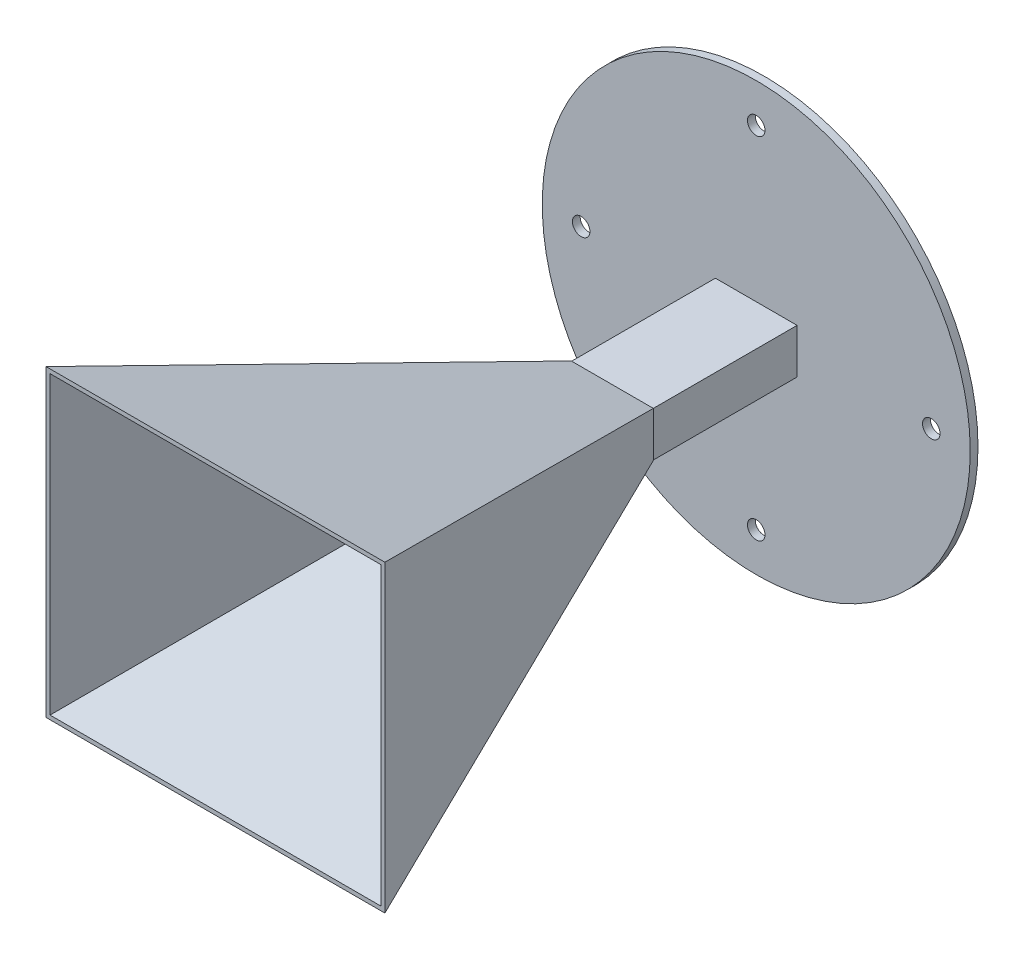
ISO-10303-21;
HEADER;
FILE_DESCRIPTION(('STEP AP214'),'2;1');
FILE_NAME('part.step','',(''),(''),'','','');
FILE_SCHEMA(('AUTOMOTIVE_DESIGN { 1 0 10303 214 1 1 1 1 }'));
ENDSEC;
DATA;
#1=APPLICATION_CONTEXT('core data for automotive mechanical design processes');
#2=APPLICATION_PROTOCOL_DEFINITION('international standard','automotive_design',2000,#1);
#3=PRODUCT_CONTEXT('',#1,'mechanical');
#4=PRODUCT('Part','Part','',(#3));
#5=PRODUCT_RELATED_PRODUCT_CATEGORY('part','',(#4));
#6=PRODUCT_DEFINITION_FORMATION('','',#4);
#7=PRODUCT_DEFINITION_CONTEXT('part definition',#1,'design');
#8=PRODUCT_DEFINITION('design','',#6,#7);
#9=PRODUCT_DEFINITION_SHAPE('','',#8);
#10=(LENGTH_UNIT() NAMED_UNIT(*) SI_UNIT(.MILLI.,.METRE.));
#11=(NAMED_UNIT(*) PLANE_ANGLE_UNIT() SI_UNIT($,.RADIAN.));
#12=(NAMED_UNIT(*) SI_UNIT($,.STERADIAN.) SOLID_ANGLE_UNIT());
#13=UNCERTAINTY_MEASURE_WITH_UNIT(LENGTH_MEASURE(1.E-05),#10,'distance_accuracy_value','');
#14=(GEOMETRIC_REPRESENTATION_CONTEXT(3) GLOBAL_UNCERTAINTY_ASSIGNED_CONTEXT((#13)) GLOBAL_UNIT_ASSIGNED_CONTEXT((#10,
#11,#12)) REPRESENTATION_CONTEXT('',''));
#15=CARTESIAN_POINT('',(0.,0.,0.));
#16=DIRECTION('',(0.,0.,1.));
#17=DIRECTION('',(1.,0.,0.));
#18=AXIS2_PLACEMENT_3D('',#15,#16,#17);
#19=CARTESIAN_POINT('',(0.,0.,2.));
#20=DIRECTION('',(0.,0.,1.));
#21=DIRECTION('',(1.,0.,0.));
#22=AXIS2_PLACEMENT_3D('',#19,#20,#21);
#23=PLANE('',#22);
#24=CARTESIAN_POINT('',(-45.,4.71349980743823E-13,2.));
#25=DIRECTION('',(0.,0.,1.));
#26=DIRECTION('',(1.,0.,0.));
#27=AXIS2_PLACEMENT_3D('',#24,#25,#26);
#28=CIRCLE('',#27,2.24999999999999);
#29=CARTESIAN_POINT('',(-42.75,4.71349980743823E-13,2.));
#30=VERTEX_POINT('',#29);
#31=EDGE_CURVE('E528',#30,#30,#28,.T.);
#32=ORIENTED_EDGE('',*,*,#31,.F.);
#33=EDGE_LOOP('',(#32));
#34=FACE_BOUND('',#33,.T.);
#35=CARTESIAN_POINT('',(0.,-45.,2.));
#36=DIRECTION('',(0.,0.,1.));
#37=DIRECTION('',(1.,0.,0.));
#38=AXIS2_PLACEMENT_3D('',#35,#36,#37);
#39=CIRCLE('',#38,2.24999999999999);
#40=CARTESIAN_POINT('',(2.24999999999999,-45.,2.));
#41=VERTEX_POINT('',#40);
#42=EDGE_CURVE('E529',#41,#41,#39,.T.);
#43=ORIENTED_EDGE('',*,*,#42,.F.);
#44=EDGE_LOOP('',(#43));
#45=FACE_BOUND('',#44,.T.);
#46=CARTESIAN_POINT('',(45.,-1.57116660247941E-13,2.));
#47=DIRECTION('',(0.,0.,1.));
#48=DIRECTION('',(1.,0.,0.));
#49=AXIS2_PLACEMENT_3D('',#46,#47,#48);
#50=CIRCLE('',#49,2.24999999999999);
#51=CARTESIAN_POINT('',(47.25,-1.57116660247941E-13,2.));
#52=VERTEX_POINT('',#51);
#53=EDGE_CURVE('E535',#52,#52,#50,.T.);
#54=ORIENTED_EDGE('',*,*,#53,.F.);
#55=EDGE_LOOP('',(#54));
#56=FACE_BOUND('',#55,.T.);
#57=CARTESIAN_POINT('',(0.,45.,2.));
#58=DIRECTION('',(0.,0.,1.));
#59=DIRECTION('',(1.,0.,0.));
#60=AXIS2_PLACEMENT_3D('',#57,#58,#59);
#61=CIRCLE('',#60,2.24999999999999);
#62=CARTESIAN_POINT('',(2.24999999999999,45.,2.));
#63=VERTEX_POINT('',#62);
#64=EDGE_CURVE('E205',#63,#63,#61,.T.);
#65=ORIENTED_EDGE('',*,*,#64,.F.);
#66=EDGE_LOOP('',(#65));
#67=FACE_BOUND('',#66,.T.);
#68=CARTESIAN_POINT('',(0.,0.,2.));
#69=DIRECTION('',(0.,0.,1.));
#70=DIRECTION('',(1.,0.,0.));
#71=AXIS2_PLACEMENT_3D('',#68,#69,#70);
#72=CIRCLE('',#71,55.);
#73=CARTESIAN_POINT('',(55.,0.,2.));
#74=VERTEX_POINT('',#73);
#75=EDGE_CURVE('E244',#74,#74,#72,.T.);
#76=ORIENTED_EDGE('',*,*,#75,.T.);
#77=EDGE_LOOP('',(#76));
#78=FACE_BOUND('',#77,.T.);
#79=DIRECTION('',(-1.,0.,0.));
#80=VECTOR('',#79,1.);
#81=CARTESIAN_POINT('',(0.,5.75,2.));
#82=LINE('',#81,#80);
#83=CARTESIAN_POINT('',(10.5,5.75,2.));
#84=VERTEX_POINT('',#83);
#85=CARTESIAN_POINT('',(-10.5,5.75,2.));
#86=VERTEX_POINT('',#85);
#87=EDGE_CURVE('E229',#84,#86,#82,.T.);
#88=ORIENTED_EDGE('',*,*,#87,.F.);
#89=DIRECTION('',(0.,1.,0.));
#90=VECTOR('',#89,1.);
#91=CARTESIAN_POINT('',(10.5,0.,2.));
#92=LINE('',#91,#90);
#93=CARTESIAN_POINT('',(10.5,-5.75,2.));
#94=VERTEX_POINT('',#93);
#95=EDGE_CURVE('E226',#94,#84,#92,.T.);
#96=ORIENTED_EDGE('',*,*,#95,.F.);
#97=DIRECTION('',(1.,0.,0.));
#98=VECTOR('',#97,1.);
#99=CARTESIAN_POINT('',(0.,-5.75,2.));
#100=LINE('',#99,#98);
#101=CARTESIAN_POINT('',(-10.5,-5.75,2.));
#102=VERTEX_POINT('',#101);
#103=EDGE_CURVE('E216',#102,#94,#100,.T.);
#104=ORIENTED_EDGE('',*,*,#103,.F.);
#105=DIRECTION('',(0.,-1.,0.));
#106=VECTOR('',#105,1.);
#107=CARTESIAN_POINT('',(-10.5,0.,2.));
#108=LINE('',#107,#106);
#109=EDGE_CURVE('E232',#86,#102,#108,.T.);
#110=ORIENTED_EDGE('',*,*,#109,.F.);
#111=EDGE_LOOP('',(#88,#96,#104,#110));
#112=FACE_BOUND('',#111,.T.);
#113=ADVANCED_FACE('F68',(#34,#45,#56,#67,#78,#112),#23,.T.);
#114=CARTESIAN_POINT('',(0.,0.,2.));
#115=DIRECTION('',(0.,0.,-1.));
#116=DIRECTION('',(-1.,0.,0.));
#117=AXIS2_PLACEMENT_3D('',#114,#115,#116);
#118=CYLINDRICAL_SURFACE('',#117,55.);
#119=ORIENTED_EDGE('',*,*,#75,.F.);
#120=EDGE_LOOP('',(#119));
#121=FACE_BOUND('',#120,.T.);
#122=CARTESIAN_POINT('',(0.,0.,0.));
#123=DIRECTION('',(0.,0.,1.));
#124=DIRECTION('',(1.,0.,0.));
#125=AXIS2_PLACEMENT_3D('',#122,#123,#124);
#126=CIRCLE('',#125,55.);
#127=CARTESIAN_POINT('',(55.,0.,0.));
#128=VERTEX_POINT('',#127);
#129=EDGE_CURVE('E243',#128,#128,#126,.T.);
#130=ORIENTED_EDGE('',*,*,#129,.T.);
#131=EDGE_LOOP('',(#130));
#132=FACE_BOUND('',#131,.T.);
#133=ADVANCED_FACE('F70',(#121,#132),#118,.T.);
#134=CARTESIAN_POINT('',(0.,0.,0.));
#135=DIRECTION('',(0.,0.,1.));
#136=DIRECTION('',(1.,0.,0.));
#137=AXIS2_PLACEMENT_3D('',#134,#135,#136);
#138=PLANE('',#137);
#139=CARTESIAN_POINT('',(-45.,4.71349980743823E-13,0.));
#140=DIRECTION('',(0.,0.,1.));
#141=DIRECTION('',(1.,0.,0.));
#142=AXIS2_PLACEMENT_3D('',#139,#140,#141);
#143=CIRCLE('',#142,2.24999999999999);
#144=CARTESIAN_POINT('',(-42.75,4.71349980743823E-13,0.));
#145=VERTEX_POINT('',#144);
#146=EDGE_CURVE('E72',#145,#145,#143,.T.);
#147=ORIENTED_EDGE('',*,*,#146,.T.);
#148=EDGE_LOOP('',(#147));
#149=FACE_BOUND('',#148,.T.);
#150=CARTESIAN_POINT('',(0.,-45.,0.));
#151=DIRECTION('',(0.,0.,1.));
#152=DIRECTION('',(1.,0.,0.));
#153=AXIS2_PLACEMENT_3D('',#150,#151,#152);
#154=CIRCLE('',#153,2.24999999999999);
#155=CARTESIAN_POINT('',(2.24999999999999,-45.,0.));
#156=VERTEX_POINT('',#155);
#157=EDGE_CURVE('E400',#156,#156,#154,.T.);
#158=ORIENTED_EDGE('',*,*,#157,.T.);
#159=EDGE_LOOP('',(#158));
#160=FACE_BOUND('',#159,.T.);
#161=CARTESIAN_POINT('',(45.,-1.57116660247941E-13,0.));
#162=DIRECTION('',(0.,0.,1.));
#163=DIRECTION('',(1.,0.,0.));
#164=AXIS2_PLACEMENT_3D('',#161,#162,#163);
#165=CIRCLE('',#164,2.24999999999999);
#166=CARTESIAN_POINT('',(47.25,-1.57116660247941E-13,0.));
#167=VERTEX_POINT('',#166);
#168=EDGE_CURVE('E404',#167,#167,#165,.T.);
#169=ORIENTED_EDGE('',*,*,#168,.T.);
#170=EDGE_LOOP('',(#169));
#171=FACE_BOUND('',#170,.T.);
#172=CARTESIAN_POINT('',(0.,45.,0.));
#173=DIRECTION('',(0.,0.,1.));
#174=DIRECTION('',(1.,0.,0.));
#175=AXIS2_PLACEMENT_3D('',#172,#173,#174);
#176=CIRCLE('',#175,2.24999999999999);
#177=CARTESIAN_POINT('',(2.24999999999999,45.,0.));
#178=VERTEX_POINT('',#177);
#179=EDGE_CURVE('E201',#178,#178,#176,.T.);
#180=ORIENTED_EDGE('',*,*,#179,.T.);
#181=EDGE_LOOP('',(#180));
#182=FACE_BOUND('',#181,.T.);
#183=DIRECTION('',(1.,0.,0.));
#184=VECTOR('',#183,1.);
#185=CARTESIAN_POINT('',(0.,-4.75,0.));
#186=LINE('',#185,#184);
#187=CARTESIAN_POINT('',(-9.5,-4.75,0.));
#188=VERTEX_POINT('',#187);
#189=CARTESIAN_POINT('',(9.5,-4.75,0.));
#190=VERTEX_POINT('',#189);
#191=EDGE_CURVE('E77',#188,#190,#186,.T.);
#192=ORIENTED_EDGE('',*,*,#191,.T.);
#193=DIRECTION('',(0.,1.,0.));
#194=VECTOR('',#193,1.);
#195=CARTESIAN_POINT('',(9.5,0.,0.));
#196=LINE('',#195,#194);
#197=CARTESIAN_POINT('',(9.5,4.75,0.));
#198=VERTEX_POINT('',#197);
#199=EDGE_CURVE('E12',#190,#198,#196,.T.);
#200=ORIENTED_EDGE('',*,*,#199,.T.);
#201=DIRECTION('',(-1.,0.,0.));
#202=VECTOR('',#201,1.);
#203=CARTESIAN_POINT('',(0.,4.75,0.));
#204=LINE('',#203,#202);
#205=CARTESIAN_POINT('',(-9.5,4.75,0.));
#206=VERTEX_POINT('',#205);
#207=EDGE_CURVE('E247',#198,#206,#204,.T.);
#208=ORIENTED_EDGE('',*,*,#207,.T.);
#209=DIRECTION('',(0.,-1.,0.));
#210=VECTOR('',#209,1.);
#211=CARTESIAN_POINT('',(-9.5,0.,0.));
#212=LINE('',#211,#210);
#213=EDGE_CURVE('E252',#206,#188,#212,.T.);
#214=ORIENTED_EDGE('',*,*,#213,.T.);
#215=EDGE_LOOP('',(#192,#200,#208,#214));
#216=FACE_BOUND('',#215,.T.);
#217=ORIENTED_EDGE('',*,*,#129,.F.);
#218=EDGE_LOOP('',(#217));
#219=FACE_BOUND('',#218,.T.);
#220=ADVANCED_FACE('F296',(#149,#160,#171,#182,#216,#219),#138,.F.);
#221=CARTESIAN_POINT('',(10.5,0.,39.));
#222=DIRECTION('',(-1.,0.,0.));
#223=DIRECTION('',(0.,0.,1.));
#224=AXIS2_PLACEMENT_3D('',#221,#222,#223);
#225=PLANE('',#224);
#226=ORIENTED_EDGE('',*,*,#95,.T.);
#227=DIRECTION('',(0.,0.,-1.));
#228=VECTOR('',#227,1.);
#229=CARTESIAN_POINT('',(10.5,5.75,39.));
#230=LINE('',#229,#228);
#231=CARTESIAN_POINT('',(10.5,5.75,39.));
#232=VERTEX_POINT('',#231);
#233=EDGE_CURVE('E241',#232,#84,#230,.T.);
#234=ORIENTED_EDGE('',*,*,#233,.F.);
#235=DIRECTION('',(0.,1.,0.));
#236=VECTOR('',#235,1.);
#237=CARTESIAN_POINT('',(10.5,0.,39.));
#238=LINE('',#237,#236);
#239=CARTESIAN_POINT('',(10.5,-5.75,39.));
#240=VERTEX_POINT('',#239);
#241=EDGE_CURVE('E212',#240,#232,#238,.T.);
#242=ORIENTED_EDGE('',*,*,#241,.F.);
#243=DIRECTION('',(0.,0.,-1.));
#244=VECTOR('',#243,1.);
#245=CARTESIAN_POINT('',(10.5,-5.75,39.));
#246=LINE('',#245,#244);
#247=EDGE_CURVE('E225',#240,#94,#246,.T.);
#248=ORIENTED_EDGE('',*,*,#247,.T.);
#249=EDGE_LOOP('',(#226,#234,#242,#248));
#250=FACE_BOUND('',#249,.T.);
#251=ADVANCED_FACE('F385',(#250),#225,.F.);
#252=CARTESIAN_POINT('',(0.,5.75,39.));
#253=DIRECTION('',(0.,-1.,0.));
#254=DIRECTION('',(0.,0.,-1.));
#255=AXIS2_PLACEMENT_3D('',#252,#253,#254);
#256=PLANE('',#255);
#257=ORIENTED_EDGE('',*,*,#87,.T.);
#258=DIRECTION('',(0.,0.,-1.));
#259=VECTOR('',#258,1.);
#260=CARTESIAN_POINT('',(-10.5,5.75,39.));
#261=LINE('',#260,#259);
#262=CARTESIAN_POINT('',(-10.5,5.75,39.));
#263=VERTEX_POINT('',#262);
#264=EDGE_CURVE('E238',#263,#86,#261,.T.);
#265=ORIENTED_EDGE('',*,*,#264,.F.);
#266=DIRECTION('',(-1.,0.,0.));
#267=VECTOR('',#266,1.);
#268=CARTESIAN_POINT('',(0.,5.75,39.));
#269=LINE('',#268,#267);
#270=EDGE_CURVE('E215',#232,#263,#269,.T.);
#271=ORIENTED_EDGE('',*,*,#270,.F.);
#272=ORIENTED_EDGE('',*,*,#233,.T.);
#273=EDGE_LOOP('',(#257,#265,#271,#272));
#274=FACE_BOUND('',#273,.T.);
#275=ADVANCED_FACE('F392',(#274),#256,.F.);
#276=CARTESIAN_POINT('',(-10.5,0.,39.));
#277=DIRECTION('',(1.,0.,0.));
#278=DIRECTION('',(0.,0.,-1.));
#279=AXIS2_PLACEMENT_3D('',#276,#277,#278);
#280=PLANE('',#279);
#281=ORIENTED_EDGE('',*,*,#109,.T.);
#282=DIRECTION('',(0.,0.,-1.));
#283=VECTOR('',#282,1.);
#284=CARTESIAN_POINT('',(-10.5,-5.75,39.));
#285=LINE('',#284,#283);
#286=CARTESIAN_POINT('',(-10.5,-5.75,39.));
#287=VERTEX_POINT('',#286);
#288=EDGE_CURVE('E93',#287,#102,#285,.T.);
#289=ORIENTED_EDGE('',*,*,#288,.F.);
#290=DIRECTION('',(0.,-1.,0.));
#291=VECTOR('',#290,1.);
#292=CARTESIAN_POINT('',(-10.5,0.,39.));
#293=LINE('',#292,#291);
#294=EDGE_CURVE('E219',#263,#287,#293,.T.);
#295=ORIENTED_EDGE('',*,*,#294,.F.);
#296=ORIENTED_EDGE('',*,*,#264,.T.);
#297=EDGE_LOOP('',(#281,#289,#295,#296));
#298=FACE_BOUND('',#297,.T.);
#299=ADVANCED_FACE('F446',(#298),#280,.F.);
#300=CARTESIAN_POINT('',(0.,-5.75,39.));
#301=DIRECTION('',(0.,1.,0.));
#302=DIRECTION('',(0.,0.,1.));
#303=AXIS2_PLACEMENT_3D('',#300,#301,#302);
#304=PLANE('',#303);
#305=ORIENTED_EDGE('',*,*,#103,.T.);
#306=ORIENTED_EDGE('',*,*,#247,.F.);
#307=DIRECTION('',(1.,0.,0.));
#308=VECTOR('',#307,1.);
#309=CARTESIAN_POINT('',(0.,-5.75,39.));
#310=LINE('',#309,#308);
#311=EDGE_CURVE('E222',#287,#240,#310,.T.);
#312=ORIENTED_EDGE('',*,*,#311,.F.);
#313=ORIENTED_EDGE('',*,*,#288,.T.);
#314=EDGE_LOOP('',(#305,#306,#312,#313));
#315=FACE_BOUND('',#314,.T.);
#316=ADVANCED_FACE('F437',(#315),#304,.F.);
#317=CARTESIAN_POINT('',(9.5,-4.75,39.));
#318=DIRECTION('',(-1.,0.,0.));
#319=DIRECTION('',(0.,0.,1.));
#320=AXIS2_PLACEMENT_3D('',#317,#318,#319);
#321=PLANE('',#320);
#322=DIRECTION('',(0.,0.,-1.));
#323=VECTOR('',#322,1.);
#324=CARTESIAN_POINT('',(9.5,4.75,39.));
#325=LINE('',#324,#323);
#326=CARTESIAN_POINT('',(9.5,4.75,39.));
#327=VERTEX_POINT('',#326);
#328=EDGE_CURVE('E230',#327,#198,#325,.T.);
#329=ORIENTED_EDGE('',*,*,#328,.T.);
#330=ORIENTED_EDGE('',*,*,#199,.F.);
#331=DIRECTION('',(0.,0.,-1.));
#332=VECTOR('',#331,1.);
#333=CARTESIAN_POINT('',(9.5,-4.75,39.));
#334=LINE('',#333,#332);
#335=CARTESIAN_POINT('',(9.5,-4.75,39.));
#336=VERTEX_POINT('',#335);
#337=EDGE_CURVE('E259',#336,#190,#334,.T.);
#338=ORIENTED_EDGE('',*,*,#337,.F.);
#339=DIRECTION('',(0.,1.,0.));
#340=VECTOR('',#339,1.);
#341=CARTESIAN_POINT('',(9.5,-4.75,39.));
#342=LINE('',#341,#340);
#343=EDGE_CURVE('E193',#336,#327,#342,.T.);
#344=ORIENTED_EDGE('',*,*,#343,.T.);
#345=EDGE_LOOP('',(#329,#330,#338,#344));
#346=FACE_BOUND('',#345,.T.);
#347=ADVANCED_FACE('F293',(#346),#321,.T.);
#348=CARTESIAN_POINT('',(-9.5,4.75,39.));
#349=DIRECTION('',(0.,-1.,0.));
#350=DIRECTION('',(0.,0.,-1.));
#351=AXIS2_PLACEMENT_3D('',#348,#349,#350);
#352=PLANE('',#351);
#353=DIRECTION('',(0.,0.,-1.));
#354=VECTOR('',#353,1.);
#355=CARTESIAN_POINT('',(-9.5,4.75,39.));
#356=LINE('',#355,#354);
#357=CARTESIAN_POINT('',(-9.5,4.75,39.));
#358=VERTEX_POINT('',#357);
#359=EDGE_CURVE('E85',#358,#206,#356,.T.);
#360=ORIENTED_EDGE('',*,*,#359,.T.);
#361=ORIENTED_EDGE('',*,*,#207,.F.);
#362=ORIENTED_EDGE('',*,*,#328,.F.);
#363=DIRECTION('',(-1.,0.,0.));
#364=VECTOR('',#363,1.);
#365=CARTESIAN_POINT('',(-9.5,4.75,39.));
#366=LINE('',#365,#364);
#367=EDGE_CURVE('E266',#327,#358,#366,.T.);
#368=ORIENTED_EDGE('',*,*,#367,.T.);
#369=EDGE_LOOP('',(#360,#361,#362,#368));
#370=FACE_BOUND('',#369,.T.);
#371=ADVANCED_FACE('F303',(#370),#352,.T.);
#372=CARTESIAN_POINT('',(-9.5,-4.75,39.));
#373=DIRECTION('',(1.,0.,0.));
#374=DIRECTION('',(0.,0.,-1.));
#375=AXIS2_PLACEMENT_3D('',#372,#373,#374);
#376=PLANE('',#375);
#377=DIRECTION('',(0.,0.,-1.));
#378=VECTOR('',#377,1.);
#379=CARTESIAN_POINT('',(-9.5,-4.75,39.));
#380=LINE('',#379,#378);
#381=CARTESIAN_POINT('',(-9.5,-4.75,39.));
#382=VERTEX_POINT('',#381);
#383=EDGE_CURVE('E257',#382,#188,#380,.T.);
#384=ORIENTED_EDGE('',*,*,#383,.T.);
#385=ORIENTED_EDGE('',*,*,#213,.F.);
#386=ORIENTED_EDGE('',*,*,#359,.F.);
#387=DIRECTION('',(0.,-1.,0.));
#388=VECTOR('',#387,1.);
#389=CARTESIAN_POINT('',(-9.5,-4.75,39.));
#390=LINE('',#389,#388);
#391=EDGE_CURVE('E262',#358,#382,#390,.T.);
#392=ORIENTED_EDGE('',*,*,#391,.T.);
#393=EDGE_LOOP('',(#384,#385,#386,#392));
#394=FACE_BOUND('',#393,.T.);
#395=ADVANCED_FACE('F299',(#394),#376,.T.);
#396=CARTESIAN_POINT('',(-9.5,-4.75,39.));
#397=DIRECTION('',(0.,1.,0.));
#398=DIRECTION('',(0.,0.,1.));
#399=AXIS2_PLACEMENT_3D('',#396,#397,#398);
#400=PLANE('',#399);
#401=ORIENTED_EDGE('',*,*,#337,.T.);
#402=ORIENTED_EDGE('',*,*,#191,.F.);
#403=ORIENTED_EDGE('',*,*,#383,.F.);
#404=DIRECTION('',(1.,0.,0.));
#405=VECTOR('',#404,1.);
#406=CARTESIAN_POINT('',(-9.5,-4.75,39.));
#407=LINE('',#406,#405);
#408=EDGE_CURVE('E265',#382,#336,#407,.T.);
#409=ORIENTED_EDGE('',*,*,#408,.T.);
#410=EDGE_LOOP('',(#401,#402,#403,#409));
#411=FACE_BOUND('',#410,.T.);
#412=ADVANCED_FACE('F290',(#411),#400,.T.);
#413=CARTESIAN_POINT('',(0.,0.,141.));
#414=DIRECTION('',(0.,0.,-1.));
#415=DIRECTION('',(-1.,0.,0.));
#416=AXIS2_PLACEMENT_3D('',#413,#414,#415);
#417=PLANE('',#416);
#418=DIRECTION('',(0.,1.,0.));
#419=VECTOR('',#418,1.);
#420=CARTESIAN_POINT('',(43.5510334344239,0.,141.));
#421=LINE('',#420,#419);
#422=CARTESIAN_POINT('',(43.5510334344239,-39.0517904810706,141.));
#423=VERTEX_POINT('',#422);
#424=CARTESIAN_POINT('',(43.5510334344239,39.0517904810706,141.));
#425=VERTEX_POINT('',#424);
#426=EDGE_CURVE('E195',#423,#425,#421,.T.);
#427=ORIENTED_EDGE('',*,*,#426,.T.);
#428=DIRECTION('',(-1.,0.,0.));
#429=VECTOR('',#428,1.);
#430=CARTESIAN_POINT('',(0.,39.0517904810706,141.));
#431=LINE('',#430,#429);
#432=CARTESIAN_POINT('',(-43.5510334344239,39.0517904810706,141.));
#433=VERTEX_POINT('',#432);
#434=EDGE_CURVE('E340',#425,#433,#431,.T.);
#435=ORIENTED_EDGE('',*,*,#434,.T.);
#436=DIRECTION('',(0.,-1.,0.));
#437=VECTOR('',#436,1.);
#438=CARTESIAN_POINT('',(-43.5510334344239,0.,141.));
#439=LINE('',#438,#437);
#440=CARTESIAN_POINT('',(-43.5510334344239,-39.0517904810706,141.));
#441=VERTEX_POINT('',#440);
#442=EDGE_CURVE('E337',#433,#441,#439,.T.);
#443=ORIENTED_EDGE('',*,*,#442,.T.);
#444=DIRECTION('',(1.,0.,0.));
#445=VECTOR('',#444,1.);
#446=CARTESIAN_POINT('',(0.,-39.0517904810706,141.));
#447=LINE('',#446,#445);
#448=EDGE_CURVE('E318',#441,#423,#447,.T.);
#449=ORIENTED_EDGE('',*,*,#448,.T.);
#450=EDGE_LOOP('',(#427,#435,#443,#449));
#451=FACE_BOUND('',#450,.T.);
#452=DIRECTION('',(0.,1.,0.));
#453=VECTOR('',#452,1.);
#454=CARTESIAN_POINT('',(42.5,-38.,141.));
#455=LINE('',#454,#453);
#456=CARTESIAN_POINT('',(42.5,-38.,141.));
#457=VERTEX_POINT('',#456);
#458=CARTESIAN_POINT('',(42.5,38.,141.));
#459=VERTEX_POINT('',#458);
#460=EDGE_CURVE('E190',#457,#459,#455,.T.);
#461=ORIENTED_EDGE('',*,*,#460,.F.);
#462=DIRECTION('',(1.,0.,0.));
#463=VECTOR('',#462,1.);
#464=CARTESIAN_POINT('',(-42.5,-38.,141.));
#465=LINE('',#464,#463);
#466=CARTESIAN_POINT('',(-42.5,-38.,141.));
#467=VERTEX_POINT('',#466);
#468=EDGE_CURVE('E173',#467,#457,#465,.T.);
#469=ORIENTED_EDGE('',*,*,#468,.F.);
#470=DIRECTION('',(0.,-1.,0.));
#471=VECTOR('',#470,1.);
#472=CARTESIAN_POINT('',(-42.5,-38.,141.));
#473=LINE('',#472,#471);
#474=CARTESIAN_POINT('',(-42.5,38.,141.));
#475=VERTEX_POINT('',#474);
#476=EDGE_CURVE('E184',#475,#467,#473,.T.);
#477=ORIENTED_EDGE('',*,*,#476,.F.);
#478=DIRECTION('',(-1.,0.,0.));
#479=VECTOR('',#478,1.);
#480=CARTESIAN_POINT('',(-42.5,38.,141.));
#481=LINE('',#480,#479);
#482=EDGE_CURVE('E200',#459,#475,#481,.T.);
#483=ORIENTED_EDGE('',*,*,#482,.F.);
#484=EDGE_LOOP('',(#461,#469,#477,#483));
#485=FACE_BOUND('',#484,.T.);
#486=ADVANCED_FACE('F198',(#451,#485),#417,.F.);
#487=CARTESIAN_POINT('',(0.,0.,39.));
#488=DIRECTION('',(0.,0.,-1.));
#489=DIRECTION('',(-1.,0.,0.));
#490=AXIS2_PLACEMENT_3D('',#487,#488,#489);
#491=PLANE('',#490);
#492=ORIENTED_EDGE('',*,*,#311,.T.);
#493=ORIENTED_EDGE('',*,*,#241,.T.);
#494=ORIENTED_EDGE('',*,*,#270,.T.);
#495=ORIENTED_EDGE('',*,*,#294,.T.);
#496=EDGE_LOOP('',(#492,#493,#494,#495));
#497=FACE_BOUND('',#496,.T.);
#498=DIRECTION('',(0.,1.,0.));
#499=VECTOR('',#498,1.);
#500=CARTESIAN_POINT('',(10.5510334344239,0.,39.));
#501=LINE('',#500,#499);
#502=CARTESIAN_POINT('',(10.5510334344239,-5.80179048107061,39.));
#503=VERTEX_POINT('',#502);
#504=CARTESIAN_POINT('',(10.5510334344239,5.80179048107061,39.));
#505=VERTEX_POINT('',#504);
#506=EDGE_CURVE('E324',#503,#505,#501,.T.);
#507=ORIENTED_EDGE('',*,*,#506,.F.);
#508=DIRECTION('',(1.,0.,0.));
#509=VECTOR('',#508,1.);
#510=CARTESIAN_POINT('',(0.,-5.80179048107061,39.));
#511=LINE('',#510,#509);
#512=CARTESIAN_POINT('',(-10.5510334344239,-5.80179048107061,39.));
#513=VERTEX_POINT('',#512);
#514=EDGE_CURVE('E279',#513,#503,#511,.T.);
#515=ORIENTED_EDGE('',*,*,#514,.F.);
#516=DIRECTION('',(0.,-1.,0.));
#517=VECTOR('',#516,1.);
#518=CARTESIAN_POINT('',(-10.5510334344239,0.,39.));
#519=LINE('',#518,#517);
#520=CARTESIAN_POINT('',(-10.5510334344239,5.80179048107061,39.));
#521=VERTEX_POINT('',#520);
#522=EDGE_CURVE('E327',#521,#513,#519,.T.);
#523=ORIENTED_EDGE('',*,*,#522,.F.);
#524=DIRECTION('',(-1.,0.,0.));
#525=VECTOR('',#524,1.);
#526=CARTESIAN_POINT('',(0.,5.80179048107061,39.));
#527=LINE('',#526,#525);
#528=EDGE_CURVE('E330',#505,#521,#527,.T.);
#529=ORIENTED_EDGE('',*,*,#528,.F.);
#530=EDGE_LOOP('',(#507,#515,#523,#529));
#531=FACE_BOUND('',#530,.T.);
#532=ADVANCED_FACE('F361',(#497,#531),#491,.T.);
#533=CARTESIAN_POINT('',(1.87079510556462,0.,0.605257240035613));
#534=DIRECTION('',(-0.951444518554411,0.,-0.307820285414663));
#535=DIRECTION('',(-0.307820285414663,0.,0.951444518554412));
#536=AXIS2_PLACEMENT_3D('',#533,#534,#535);
#537=PLANE('',#536);
#538=DIRECTION('',(0.294004137651396,-0.296231441724512,-0.908740061831587));
#539=VECTOR('',#538,1.);
#540=CARTESIAN_POINT('',(1.28603845496371,-6.12495619535777,2.41268688734753));
#541=LINE('',#540,#539);
#542=EDGE_CURVE('E314',#433,#521,#541,.T.);
#543=ORIENTED_EDGE('',*,*,#542,.T.);
#544=ORIENTED_EDGE('',*,*,#522,.T.);
#545=DIRECTION('',(0.294004137651396,0.296231441724512,-0.908740061831587));
#546=VECTOR('',#545,1.);
#547=CARTESIAN_POINT('',(1.28603845496371,6.12495619535777,2.41268688734753));
#548=LINE('',#547,#546);
#549=EDGE_CURVE('E317',#441,#513,#548,.T.);
#550=ORIENTED_EDGE('',*,*,#549,.F.);
#551=ORIENTED_EDGE('',*,*,#442,.F.);
#552=EDGE_LOOP('',(#543,#544,#550,#551));
#553=FACE_BOUND('',#552,.T.);
#554=ADVANCED_FACE('F363',(#553),#537,.T.);
#555=CARTESIAN_POINT('',(0.,6.2475590914026,2.03658176263859));
#556=DIRECTION('',(0.,-0.950759697865024,-0.309929019156981));
#557=DIRECTION('',(0.,0.309929019156981,-0.950759697865024));
#558=AXIS2_PLACEMENT_3D('',#555,#556,#557);
#559=PLANE('',#558);
#560=ORIENTED_EDGE('',*,*,#549,.T.);
#561=ORIENTED_EDGE('',*,*,#514,.T.);
#562=DIRECTION('',(-0.294004137651396,0.296231441724512,-0.908740061831587));
#563=VECTOR('',#562,1.);
#564=CARTESIAN_POINT('',(-1.2860384549637,6.12495619535777,2.41268688734753));
#565=LINE('',#564,#563);
#566=EDGE_CURVE('E322',#423,#503,#565,.T.);
#567=ORIENTED_EDGE('',*,*,#566,.F.);
#568=ORIENTED_EDGE('',*,*,#448,.F.);
#569=EDGE_LOOP('',(#560,#561,#567,#568));
#570=FACE_BOUND('',#569,.T.);
#571=ADVANCED_FACE('F366',(#570),#559,.T.);
#572=CARTESIAN_POINT('',(0.,-6.24755909140259,2.03658176263859));
#573=DIRECTION('',(0.,0.950759697865024,-0.309929019156981));
#574=DIRECTION('',(0.,0.309929019156981,0.950759697865024));
#575=AXIS2_PLACEMENT_3D('',#572,#573,#574);
#576=PLANE('',#575);
#577=DIRECTION('',(-0.294004137651396,-0.296231441724512,-0.908740061831587));
#578=VECTOR('',#577,1.);
#579=CARTESIAN_POINT('',(-1.2860384549637,-6.12495619535777,2.41268688734753));
#580=LINE('',#579,#578);
#581=EDGE_CURVE('E321',#425,#505,#580,.T.);
#582=ORIENTED_EDGE('',*,*,#581,.T.);
#583=ORIENTED_EDGE('',*,*,#528,.T.);
#584=ORIENTED_EDGE('',*,*,#542,.F.);
#585=ORIENTED_EDGE('',*,*,#434,.F.);
#586=EDGE_LOOP('',(#582,#583,#584,#585));
#587=FACE_BOUND('',#586,.T.);
#588=ADVANCED_FACE('F355',(#587),#576,.T.);
#589=CARTESIAN_POINT('',(-1.87079510556462,0.,0.605257240035611));
#590=DIRECTION('',(0.951444518554411,0.,-0.307820285414662));
#591=DIRECTION('',(-0.307820285414662,0.,-0.951444518554412));
#592=AXIS2_PLACEMENT_3D('',#589,#590,#591);
#593=PLANE('',#592);
#594=ORIENTED_EDGE('',*,*,#566,.T.);
#595=ORIENTED_EDGE('',*,*,#506,.T.);
#596=ORIENTED_EDGE('',*,*,#581,.F.);
#597=ORIENTED_EDGE('',*,*,#426,.F.);
#598=EDGE_LOOP('',(#594,#595,#596,#597));
#599=FACE_BOUND('',#598,.T.);
#600=ADVANCED_FACE('F357',(#599),#593,.T.);
#601=CARTESIAN_POINT('',(2.82223962411903,0.,0.913077525450275));
#602=DIRECTION('',(-0.951444518554411,0.,-0.307820285414663));
#603=DIRECTION('',(-0.307820285414663,0.,0.951444518554412));
#604=AXIS2_PLACEMENT_3D('',#601,#602,#603);
#605=PLANE('',#604);
#606=DIRECTION('',(0.294004137651396,-0.296231441724512,-0.908740061831587));
#607=VECTOR('',#606,1.);
#608=CARTESIAN_POINT('',(-42.5,38.,141.));
#609=LINE('',#608,#607);
#610=EDGE_CURVE('E183',#475,#358,#609,.T.);
#611=ORIENTED_EDGE('',*,*,#610,.F.);
#612=ORIENTED_EDGE('',*,*,#476,.T.);
#613=DIRECTION('',(0.294004137651396,0.296231441724512,-0.908740061831587));
#614=VECTOR('',#613,1.);
#615=CARTESIAN_POINT('',(-42.5,-38.,141.));
#616=LINE('',#615,#614);
#617=EDGE_CURVE('E179',#467,#382,#616,.T.);
#618=ORIENTED_EDGE('',*,*,#617,.T.);
#619=ORIENTED_EDGE('',*,*,#391,.F.);
#620=EDGE_LOOP('',(#611,#612,#618,#619));
#621=FACE_BOUND('',#620,.T.);
#622=ADVANCED_FACE('F302',(#621),#605,.F.);
#623=CARTESIAN_POINT('',(0.,7.19831878926762,2.34651078179557));
#624=DIRECTION('',(0.,-0.950759697865024,-0.309929019156981));
#625=DIRECTION('',(0.,0.309929019156981,-0.950759697865024));
#626=AXIS2_PLACEMENT_3D('',#623,#624,#625);
#627=PLANE('',#626);
#628=ORIENTED_EDGE('',*,*,#617,.F.);
#629=ORIENTED_EDGE('',*,*,#468,.T.);
#630=DIRECTION('',(-0.294004137651396,0.296231441724512,-0.908740061831587));
#631=VECTOR('',#630,1.);
#632=CARTESIAN_POINT('',(42.5,-38.,141.));
#633=LINE('',#632,#631);
#634=EDGE_CURVE('E177',#457,#336,#633,.T.);
#635=ORIENTED_EDGE('',*,*,#634,.T.);
#636=ORIENTED_EDGE('',*,*,#408,.F.);
#637=EDGE_LOOP('',(#628,#629,#635,#636));
#638=FACE_BOUND('',#637,.T.);
#639=ADVANCED_FACE('F175',(#638),#627,.F.);
#640=CARTESIAN_POINT('',(0.,-7.19831878926762,2.34651078179557));
#641=DIRECTION('',(0.,0.950759697865024,-0.309929019156981));
#642=DIRECTION('',(0.,0.309929019156981,0.950759697865024));
#643=AXIS2_PLACEMENT_3D('',#640,#641,#642);
#644=PLANE('',#643);
#645=DIRECTION('',(-0.294004137651396,-0.296231441724512,-0.908740061831587));
#646=VECTOR('',#645,1.);
#647=CARTESIAN_POINT('',(42.5,38.,141.));
#648=LINE('',#647,#646);
#649=EDGE_CURVE('E196',#459,#327,#648,.T.);
#650=ORIENTED_EDGE('',*,*,#649,.F.);
#651=ORIENTED_EDGE('',*,*,#482,.T.);
#652=ORIENTED_EDGE('',*,*,#610,.T.);
#653=ORIENTED_EDGE('',*,*,#367,.F.);
#654=EDGE_LOOP('',(#650,#651,#652,#653));
#655=FACE_BOUND('',#654,.T.);
#656=ADVANCED_FACE('F305',(#655),#644,.F.);
#657=CARTESIAN_POINT('',(-2.82223962411903,0.,0.913077525450273));
#658=DIRECTION('',(0.951444518554411,0.,-0.307820285414662));
#659=DIRECTION('',(-0.307820285414662,0.,-0.951444518554412));
#660=AXIS2_PLACEMENT_3D('',#657,#658,#659);
#661=PLANE('',#660);
#662=ORIENTED_EDGE('',*,*,#634,.F.);
#663=ORIENTED_EDGE('',*,*,#460,.T.);
#664=ORIENTED_EDGE('',*,*,#649,.T.);
#665=ORIENTED_EDGE('',*,*,#343,.F.);
#666=EDGE_LOOP('',(#662,#663,#664,#665));
#667=FACE_BOUND('',#666,.T.);
#668=ADVANCED_FACE('F188',(#667),#661,.F.);
#669=CARTESIAN_POINT('',(0.,45.,2.));
#670=DIRECTION('',(0.,0.,1.));
#671=DIRECTION('',(1.,0.,0.));
#672=AXIS2_PLACEMENT_3D('',#669,#670,#671);
#673=CYLINDRICAL_SURFACE('',#672,2.24999999999999);
#674=ORIENTED_EDGE('',*,*,#64,.T.);
#675=EDGE_LOOP('',(#674));
#676=FACE_BOUND('',#675,.T.);
#677=ORIENTED_EDGE('',*,*,#179,.F.);
#678=EDGE_LOOP('',(#677));
#679=FACE_BOUND('',#678,.T.);
#680=ADVANCED_FACE('F407',(#676,#679),#673,.F.);
#681=CARTESIAN_POINT('',(45.,-1.57116660247941E-13,2.));
#682=DIRECTION('',(0.,0.,1.));
#683=DIRECTION('',(1.,0.,0.));
#684=AXIS2_PLACEMENT_3D('',#681,#682,#683);
#685=CYLINDRICAL_SURFACE('',#684,2.24999999999999);
#686=ORIENTED_EDGE('',*,*,#53,.T.);
#687=EDGE_LOOP('',(#686));
#688=FACE_BOUND('',#687,.T.);
#689=ORIENTED_EDGE('',*,*,#168,.F.);
#690=EDGE_LOOP('',(#689));
#691=FACE_BOUND('',#690,.T.);
#692=ADVANCED_FACE('F409',(#688,#691),#685,.F.);
#693=CARTESIAN_POINT('',(0.,-45.,2.));
#694=DIRECTION('',(0.,0.,1.));
#695=DIRECTION('',(1.,0.,0.));
#696=AXIS2_PLACEMENT_3D('',#693,#694,#695);
#697=CYLINDRICAL_SURFACE('',#696,2.24999999999999);
#698=ORIENTED_EDGE('',*,*,#42,.T.);
#699=EDGE_LOOP('',(#698));
#700=FACE_BOUND('',#699,.T.);
#701=ORIENTED_EDGE('',*,*,#157,.F.);
#702=EDGE_LOOP('',(#701));
#703=FACE_BOUND('',#702,.T.);
#704=ADVANCED_FACE('F416',(#700,#703),#697,.F.);
#705=CARTESIAN_POINT('',(-45.,4.71349980743823E-13,2.));
#706=DIRECTION('',(0.,0.,1.));
#707=DIRECTION('',(1.,0.,0.));
#708=AXIS2_PLACEMENT_3D('',#705,#706,#707);
#709=CYLINDRICAL_SURFACE('',#708,2.24999999999999);
#710=ORIENTED_EDGE('',*,*,#31,.T.);
#711=EDGE_LOOP('',(#710));
#712=FACE_BOUND('',#711,.T.);
#713=ORIENTED_EDGE('',*,*,#146,.F.);
#714=EDGE_LOOP('',(#713));
#715=FACE_BOUND('',#714,.T.);
#716=ADVANCED_FACE('F513',(#712,#715),#709,.F.);
#717=CLOSED_SHELL('',(#113,#133,#220,#251,#275,#299,#316,#347,#371,#395,#412,#486,#532,#554,
#571,#588,#600,#622,#639,#656,#668,#680,#692,#704,#716));
#718=MANIFOLD_SOLID_BREP('B2',#717);
#719=ADVANCED_BREP_SHAPE_REPRESENTATION('',(#18,#718),#14);
#720=SHAPE_DEFINITION_REPRESENTATION(#9,#719);
ENDSEC;
END-ISO-10303-21;
